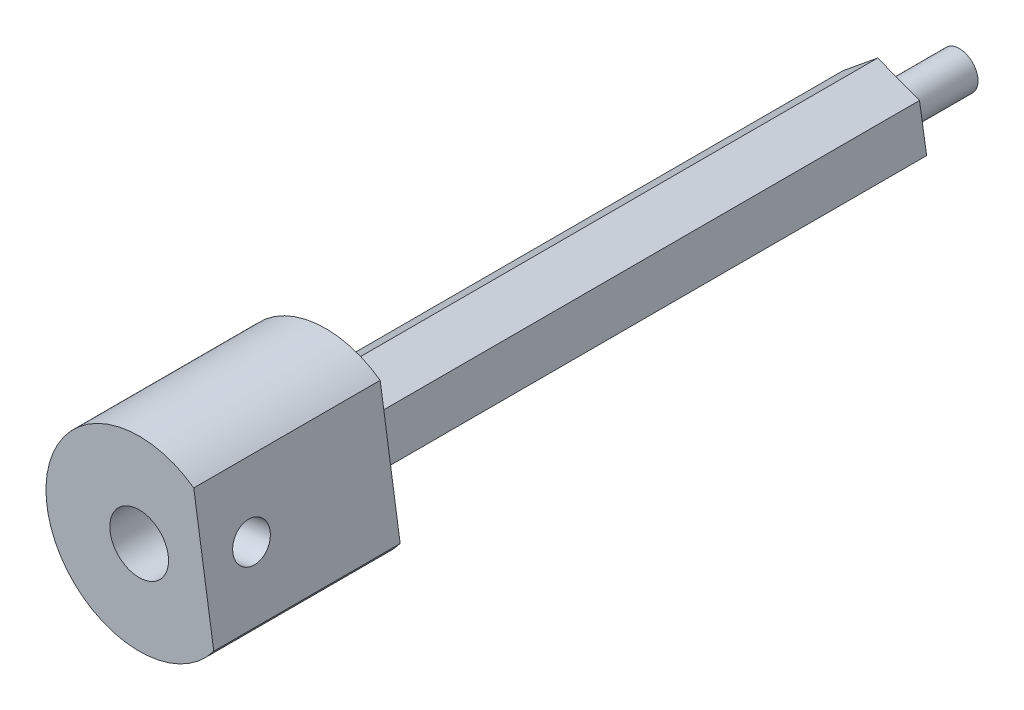
ISO-10303-21;
HEADER;
FILE_DESCRIPTION(('STEP AP214'),'2;1');
FILE_NAME('part.step','',(''),(''),'','','');
FILE_SCHEMA(('AUTOMOTIVE_DESIGN { 1 0 10303 214 1 1 1 1 }'));
ENDSEC;
DATA;
#1=APPLICATION_CONTEXT('core data for automotive mechanical design processes');
#2=APPLICATION_PROTOCOL_DEFINITION('international standard','automotive_design',2000,#1);
#3=PRODUCT_CONTEXT('',#1,'mechanical');
#4=PRODUCT('Part','Part','',(#3));
#5=PRODUCT_RELATED_PRODUCT_CATEGORY('part','',(#4));
#6=PRODUCT_DEFINITION_FORMATION('','',#4);
#7=PRODUCT_DEFINITION_CONTEXT('part definition',#1,'design');
#8=PRODUCT_DEFINITION('design','',#6,#7);
#9=PRODUCT_DEFINITION_SHAPE('','',#8);
#10=(LENGTH_UNIT() NAMED_UNIT(*) SI_UNIT(.MILLI.,.METRE.));
#11=(NAMED_UNIT(*) PLANE_ANGLE_UNIT() SI_UNIT($,.RADIAN.));
#12=(NAMED_UNIT(*) SI_UNIT($,.STERADIAN.) SOLID_ANGLE_UNIT());
#13=UNCERTAINTY_MEASURE_WITH_UNIT(LENGTH_MEASURE(1.E-05),#10,'distance_accuracy_value','');
#14=(GEOMETRIC_REPRESENTATION_CONTEXT(3) GLOBAL_UNCERTAINTY_ASSIGNED_CONTEXT((#13)) GLOBAL_UNIT_ASSIGNED_CONTEXT((#10,
#11,#12)) REPRESENTATION_CONTEXT('',''));
#15=CARTESIAN_POINT('',(0.,0.,0.));
#16=DIRECTION('',(0.,0.,1.));
#17=DIRECTION('',(1.,0.,0.));
#18=AXIS2_PLACEMENT_3D('',#15,#16,#17);
#19=CARTESIAN_POINT('',(0.,0.,0.));
#20=DIRECTION('',(0.,0.,1.));
#21=DIRECTION('',(1.,0.,0.));
#22=AXIS2_PLACEMENT_3D('',#19,#20,#21);
#23=PLANE('',#22);
#24=CARTESIAN_POINT('',(0.,0.,0.));
#25=DIRECTION('',(0.,0.,1.));
#26=DIRECTION('',(1.,0.,0.));
#27=AXIS2_PLACEMENT_3D('',#24,#25,#26);
#28=CIRCLE('',#27,6.35);
#29=CARTESIAN_POINT('',(3.71849353780113,5.14735911019731,0.));
#30=VERTEX_POINT('',#29);
#31=CARTESIAN_POINT('',(5.08203888635515,-3.80727996837298,0.));
#32=VERTEX_POINT('',#31);
#33=EDGE_CURVE('E120',#30,#32,#28,.T.);
#34=ORIENTED_EDGE('',*,*,#33,.F.);
#35=DIRECTION('',(-0.150537261404653,0.988604335884072,0.));
#36=VECTOR('',#35,1.);
#37=CARTESIAN_POINT('',(5.08203888635515,-3.80727996837298,0.));
#38=LINE('',#37,#36);
#39=EDGE_CURVE('E111',#32,#30,#38,.T.);
#40=ORIENTED_EDGE('',*,*,#39,.F.);
#41=EDGE_LOOP('',(#34,#40));
#42=FACE_BOUND('',#41,.T.);
#43=DIRECTION('',(0.774557855145261,0.632503066421636,0.));
#44=VECTOR('',#43,1.);
#45=CARTESIAN_POINT('',(-2.85,1.08061963813011,0.));
#46=LINE('',#45,#44);
#47=CARTESIAN_POINT('',(-2.85,1.08061963813011,0.));
#48=VERTEX_POINT('',#47);
#49=CARTESIAN_POINT('',(-0.489155941550974,3.00848221985071,0.));
#50=VERTEX_POINT('',#49);
#51=EDGE_CURVE('E68',#48,#50,#46,.T.);
#52=ORIENTED_EDGE('',*,*,#51,.F.);
#53=DIRECTION('',(-0.160484795920062,0.987038312467402,0.));
#54=VECTOR('',#53,1.);
#55=CARTESIAN_POINT('',(-2.36084405844903,-1.92786258172059,0.));
#56=LINE('',#55,#54);
#57=CARTESIAN_POINT('',(-2.36084405844903,-1.92786258172059,0.));
#58=VERTEX_POINT('',#57);
#59=EDGE_CURVE('E155',#58,#48,#56,.T.);
#60=ORIENTED_EDGE('',*,*,#59,.F.);
#61=DIRECTION('',(-0.935042651065324,0.354535246045766,0.));
#62=VECTOR('',#61,1.);
#63=CARTESIAN_POINT('',(0.489155941550972,-3.00848221985071,0.));
#64=LINE('',#63,#62);
#65=CARTESIAN_POINT('',(0.489155941550972,-3.00848221985071,0.));
#66=VERTEX_POINT('',#65);
#67=EDGE_CURVE('E159',#66,#58,#64,.T.);
#68=ORIENTED_EDGE('',*,*,#67,.F.);
#69=DIRECTION('',(-0.774557855145261,-0.632503066421636,0.));
#70=VECTOR('',#69,1.);
#71=CARTESIAN_POINT('',(2.85,-1.08061963813011,0.));
#72=LINE('',#71,#70);
#73=CARTESIAN_POINT('',(2.85,-1.08061963813011,0.));
#74=VERTEX_POINT('',#73);
#75=EDGE_CURVE('E163',#74,#66,#72,.T.);
#76=ORIENTED_EDGE('',*,*,#75,.F.);
#77=DIRECTION('',(0.160484795920062,-0.987038312467402,0.));
#78=VECTOR('',#77,1.);
#79=CARTESIAN_POINT('',(2.36084405844903,1.92786258172059,0.));
#80=LINE('',#79,#78);
#81=CARTESIAN_POINT('',(2.36084405844903,1.92786258172059,0.));
#82=VERTEX_POINT('',#81);
#83=EDGE_CURVE('E167',#82,#74,#80,.T.);
#84=ORIENTED_EDGE('',*,*,#83,.F.);
#85=DIRECTION('',(0.935042651065323,-0.354535246045766,0.));
#86=VECTOR('',#85,1.);
#87=CARTESIAN_POINT('',(-0.489155941550974,3.00848221985071,0.));
#88=LINE('',#87,#86);
#89=EDGE_CURVE('E171',#50,#82,#88,.T.);
#90=ORIENTED_EDGE('',*,*,#89,.F.);
#91=EDGE_LOOP('',(#52,#60,#68,#76,#84,#90));
#92=FACE_BOUND('',#91,.T.);
#93=ADVANCED_FACE('F39',(#42,#92),#23,.F.);
#94=CARTESIAN_POINT('',(0.,0.,12.7));
#95=DIRECTION('',(0.,0.,-1.));
#96=DIRECTION('',(-1.,0.,0.));
#97=AXIS2_PLACEMENT_3D('',#94,#95,#96);
#98=CYLINDRICAL_SURFACE('',#97,6.35);
#99=CARTESIAN_POINT('',(0.,0.,12.7));
#100=DIRECTION('',(0.,0.,1.));
#101=DIRECTION('',(1.,0.,0.));
#102=AXIS2_PLACEMENT_3D('',#99,#100,#101);
#103=CIRCLE('',#102,6.35);
#104=CARTESIAN_POINT('',(3.71849353780113,5.14735911019731,12.7));
#105=VERTEX_POINT('',#104);
#106=CARTESIAN_POINT('',(5.08203888635515,-3.80727996837298,12.7));
#107=VERTEX_POINT('',#106);
#108=EDGE_CURVE('E125',#105,#107,#103,.T.);
#109=ORIENTED_EDGE('',*,*,#108,.F.);
#110=DIRECTION('',(0.,0.,-1.));
#111=VECTOR('',#110,1.);
#112=CARTESIAN_POINT('',(3.71849353780113,5.14735911019731,13.97));
#113=LINE('',#112,#111);
#114=EDGE_CURVE('E60',#105,#30,#113,.T.);
#115=ORIENTED_EDGE('',*,*,#114,.T.);
#116=ORIENTED_EDGE('',*,*,#33,.T.);
#117=DIRECTION('',(0.,0.,-1.));
#118=VECTOR('',#117,1.);
#119=CARTESIAN_POINT('',(5.08203888635515,-3.80727996837298,13.97));
#120=LINE('',#119,#118);
#121=EDGE_CURVE('E108',#107,#32,#120,.T.);
#122=ORIENTED_EDGE('',*,*,#121,.F.);
#123=EDGE_LOOP('',(#109,#115,#116,#122));
#124=FACE_BOUND('',#123,.T.);
#125=ADVANCED_FACE('F41',(#124),#98,.T.);
#126=CARTESIAN_POINT('',(0.,0.,12.7));
#127=DIRECTION('',(0.,0.,1.));
#128=DIRECTION('',(1.,0.,0.));
#129=AXIS2_PLACEMENT_3D('',#126,#127,#128);
#130=PLANE('',#129);
#131=CARTESIAN_POINT('',(0.,0.,12.7));
#132=DIRECTION('',(0.,0.,1.));
#133=DIRECTION('',(1.,0.,0.));
#134=AXIS2_PLACEMENT_3D('',#131,#132,#133);
#135=CIRCLE('',#134,2.);
#136=CARTESIAN_POINT('',(2.,0.,12.7));
#137=VERTEX_POINT('',#136);
#138=EDGE_CURVE('E206',#137,#137,#135,.T.);
#139=ORIENTED_EDGE('',*,*,#138,.F.);
#140=EDGE_LOOP('',(#139));
#141=FACE_BOUND('',#140,.T.);
#142=DIRECTION('',(0.150537261404653,-0.988604335884072,0.));
#143=VECTOR('',#142,1.);
#144=CARTESIAN_POINT('',(4.40026621207814,0.670039570912164,12.7));
#145=LINE('',#144,#143);
#146=EDGE_CURVE('E11',#105,#107,#145,.T.);
#147=ORIENTED_EDGE('',*,*,#146,.F.);
#148=ORIENTED_EDGE('',*,*,#108,.T.);
#149=EDGE_LOOP('',(#147,#148));
#150=FACE_BOUND('',#149,.T.);
#151=ADVANCED_FACE('F237',(#141,#150),#130,.T.);
#152=CARTESIAN_POINT('',(-2.85,1.08061963813011,-38.1));
#153=DIRECTION('',(0.632503066421636,-0.774557855145261,0.));
#154=DIRECTION('',(0.774557855145261,0.632503066421636,0.));
#155=AXIS2_PLACEMENT_3D('',#152,#153,#154);
#156=PLANE('',#155);
#157=ORIENTED_EDGE('',*,*,#51,.T.);
#158=DIRECTION('',(0.,0.,1.));
#159=VECTOR('',#158,1.);
#160=CARTESIAN_POINT('',(-0.489155941550974,3.00848221985071,-38.1));
#161=LINE('',#160,#159);
#162=CARTESIAN_POINT('',(-0.489155941550974,3.00848221985071,-38.1));
#163=VERTEX_POINT('',#162);
#164=EDGE_CURVE('E126',#163,#50,#161,.T.);
#165=ORIENTED_EDGE('',*,*,#164,.F.);
#166=DIRECTION('',(0.774557855145261,0.632503066421636,0.));
#167=VECTOR('',#166,1.);
#168=CARTESIAN_POINT('',(-2.85,1.08061963813011,-38.1));
#169=LINE('',#168,#167);
#170=CARTESIAN_POINT('',(-2.85,1.08061963813011,-38.1));
#171=VERTEX_POINT('',#170);
#172=EDGE_CURVE('E158',#171,#163,#169,.T.);
#173=ORIENTED_EDGE('',*,*,#172,.F.);
#174=DIRECTION('',(0.,0.,1.));
#175=VECTOR('',#174,1.);
#176=CARTESIAN_POINT('',(-2.85,1.08061963813011,-38.1));
#177=LINE('',#176,#175);
#178=EDGE_CURVE('E150',#171,#48,#177,.T.);
#179=ORIENTED_EDGE('',*,*,#178,.T.);
#180=EDGE_LOOP('',(#157,#165,#173,#179));
#181=FACE_BOUND('',#180,.T.);
#182=ADVANCED_FACE('F241',(#181),#156,.F.);
#183=CARTESIAN_POINT('',(-0.489155941550974,3.00848221985071,-38.1));
#184=DIRECTION('',(-0.354535246045766,-0.935042651065323,0.));
#185=DIRECTION('',(0.935042651065324,-0.354535246045766,0.));
#186=AXIS2_PLACEMENT_3D('',#183,#184,#185);
#187=PLANE('',#186);
#188=ORIENTED_EDGE('',*,*,#89,.T.);
#189=DIRECTION('',(0.,0.,1.));
#190=VECTOR('',#189,1.);
#191=CARTESIAN_POINT('',(2.36084405844903,1.92786258172059,-38.1));
#192=LINE('',#191,#190);
#193=CARTESIAN_POINT('',(2.36084405844903,1.92786258172059,-38.1));
#194=VERTEX_POINT('',#193);
#195=EDGE_CURVE('E132',#194,#82,#192,.T.);
#196=ORIENTED_EDGE('',*,*,#195,.F.);
#197=DIRECTION('',(0.935042651065323,-0.354535246045766,0.));
#198=VECTOR('',#197,1.);
#199=CARTESIAN_POINT('',(-0.489155941550974,3.00848221985071,-38.1));
#200=LINE('',#199,#198);
#201=EDGE_CURVE('E189',#163,#194,#200,.T.);
#202=ORIENTED_EDGE('',*,*,#201,.F.);
#203=ORIENTED_EDGE('',*,*,#164,.T.);
#204=EDGE_LOOP('',(#188,#196,#202,#203));
#205=FACE_BOUND('',#204,.T.);
#206=ADVANCED_FACE('F245',(#205),#187,.F.);
#207=CARTESIAN_POINT('',(2.36084405844903,1.92786258172059,-38.1));
#208=DIRECTION('',(-0.987038312467402,-0.160484795920062,0.));
#209=DIRECTION('',(0.160484795920062,-0.987038312467402,0.));
#210=AXIS2_PLACEMENT_3D('',#207,#208,#209);
#211=PLANE('',#210);
#212=ORIENTED_EDGE('',*,*,#83,.T.);
#213=DIRECTION('',(0.,0.,1.));
#214=VECTOR('',#213,1.);
#215=CARTESIAN_POINT('',(2.85,-1.08061963813011,-38.1));
#216=LINE('',#215,#214);
#217=CARTESIAN_POINT('',(2.85,-1.08061963813011,-38.1));
#218=VERTEX_POINT('',#217);
#219=EDGE_CURVE('E138',#218,#74,#216,.T.);
#220=ORIENTED_EDGE('',*,*,#219,.F.);
#221=DIRECTION('',(0.160484795920062,-0.987038312467402,0.));
#222=VECTOR('',#221,1.);
#223=CARTESIAN_POINT('',(2.36084405844903,1.92786258172059,-38.1));
#224=LINE('',#223,#222);
#225=EDGE_CURVE('E186',#194,#218,#224,.T.);
#226=ORIENTED_EDGE('',*,*,#225,.F.);
#227=ORIENTED_EDGE('',*,*,#195,.T.);
#228=EDGE_LOOP('',(#212,#220,#226,#227));
#229=FACE_BOUND('',#228,.T.);
#230=ADVANCED_FACE('F249',(#229),#211,.F.);
#231=CARTESIAN_POINT('',(2.85,-1.08061963813011,-38.1));
#232=DIRECTION('',(-0.632503066421636,0.774557855145261,0.));
#233=DIRECTION('',(-0.774557855145261,-0.632503066421636,0.));
#234=AXIS2_PLACEMENT_3D('',#231,#232,#233);
#235=PLANE('',#234);
#236=ORIENTED_EDGE('',*,*,#75,.T.);
#237=DIRECTION('',(0.,0.,1.));
#238=VECTOR('',#237,1.);
#239=CARTESIAN_POINT('',(0.489155941550972,-3.00848221985071,-38.1));
#240=LINE('',#239,#238);
#241=CARTESIAN_POINT('',(0.489155941550972,-3.00848221985071,-38.1));
#242=VERTEX_POINT('',#241);
#243=EDGE_CURVE('E142',#242,#66,#240,.T.);
#244=ORIENTED_EDGE('',*,*,#243,.F.);
#245=DIRECTION('',(-0.774557855145261,-0.632503066421636,0.));
#246=VECTOR('',#245,1.);
#247=CARTESIAN_POINT('',(2.85,-1.08061963813011,-38.1));
#248=LINE('',#247,#246);
#249=EDGE_CURVE('E183',#218,#242,#248,.T.);
#250=ORIENTED_EDGE('',*,*,#249,.F.);
#251=ORIENTED_EDGE('',*,*,#219,.T.);
#252=EDGE_LOOP('',(#236,#244,#250,#251));
#253=FACE_BOUND('',#252,.T.);
#254=ADVANCED_FACE('F253',(#253),#235,.F.);
#255=CARTESIAN_POINT('',(0.489155941550972,-3.00848221985071,-38.1));
#256=DIRECTION('',(0.354535246045766,0.935042651065323,0.));
#257=DIRECTION('',(-0.935042651065324,0.354535246045766,0.));
#258=AXIS2_PLACEMENT_3D('',#255,#256,#257);
#259=PLANE('',#258);
#260=ORIENTED_EDGE('',*,*,#67,.T.);
#261=DIRECTION('',(0.,0.,1.));
#262=VECTOR('',#261,1.);
#263=CARTESIAN_POINT('',(-2.36084405844903,-1.92786258172059,-38.1));
#264=LINE('',#263,#262);
#265=CARTESIAN_POINT('',(-2.36084405844903,-1.92786258172059,-38.1));
#266=VERTEX_POINT('',#265);
#267=EDGE_CURVE('E146',#266,#58,#264,.T.);
#268=ORIENTED_EDGE('',*,*,#267,.F.);
#269=DIRECTION('',(-0.935042651065324,0.354535246045766,0.));
#270=VECTOR('',#269,1.);
#271=CARTESIAN_POINT('',(0.489155941550972,-3.00848221985071,-38.1));
#272=LINE('',#271,#270);
#273=EDGE_CURVE('E180',#242,#266,#272,.T.);
#274=ORIENTED_EDGE('',*,*,#273,.F.);
#275=ORIENTED_EDGE('',*,*,#243,.T.);
#276=EDGE_LOOP('',(#260,#268,#274,#275));
#277=FACE_BOUND('',#276,.T.);
#278=ADVANCED_FACE('F257',(#277),#259,.F.);
#279=CARTESIAN_POINT('',(-2.36084405844903,-1.92786258172059,-38.1));
#280=DIRECTION('',(0.987038312467402,0.160484795920062,0.));
#281=DIRECTION('',(-0.160484795920062,0.987038312467402,0.));
#282=AXIS2_PLACEMENT_3D('',#279,#280,#281);
#283=PLANE('',#282);
#284=ORIENTED_EDGE('',*,*,#59,.T.);
#285=ORIENTED_EDGE('',*,*,#178,.F.);
#286=DIRECTION('',(-0.160484795920062,0.987038312467402,0.));
#287=VECTOR('',#286,1.);
#288=CARTESIAN_POINT('',(-2.36084405844903,-1.92786258172059,-38.1));
#289=LINE('',#288,#287);
#290=EDGE_CURVE('E154',#266,#171,#289,.T.);
#291=ORIENTED_EDGE('',*,*,#290,.F.);
#292=ORIENTED_EDGE('',*,*,#267,.T.);
#293=EDGE_LOOP('',(#284,#285,#291,#292));
#294=FACE_BOUND('',#293,.T.);
#295=ADVANCED_FACE('F261',(#294),#283,.F.);
#296=CARTESIAN_POINT('',(0.,0.,-38.1));
#297=DIRECTION('',(0.,0.,-1.));
#298=DIRECTION('',(-1.,0.,0.));
#299=AXIS2_PLACEMENT_3D('',#296,#297,#298);
#300=PLANE('',#299);
#301=CARTESIAN_POINT('',(0.,0.,-38.1));
#302=DIRECTION('',(0.,0.,-1.));
#303=DIRECTION('',(-1.,0.,0.));
#304=AXIS2_PLACEMENT_3D('',#301,#302,#303);
#305=CIRCLE('',#304,1.27);
#306=CARTESIAN_POINT('',(-1.27,0.,-38.1));
#307=VERTEX_POINT('',#306);
#308=EDGE_CURVE('E54',#307,#307,#305,.T.);
#309=ORIENTED_EDGE('',*,*,#308,.F.);
#310=EDGE_LOOP('',(#309));
#311=FACE_BOUND('',#310,.T.);
#312=ORIENTED_EDGE('',*,*,#172,.T.);
#313=ORIENTED_EDGE('',*,*,#201,.T.);
#314=ORIENTED_EDGE('',*,*,#225,.T.);
#315=ORIENTED_EDGE('',*,*,#249,.T.);
#316=ORIENTED_EDGE('',*,*,#273,.T.);
#317=ORIENTED_EDGE('',*,*,#290,.T.);
#318=EDGE_LOOP('',(#312,#313,#314,#315,#316,#317));
#319=FACE_BOUND('',#318,.T.);
#320=ADVANCED_FACE('F265',(#311,#319),#300,.T.);
#321=CARTESIAN_POINT('',(0.,0.,-43.18));
#322=DIRECTION('',(0.,0.,1.));
#323=DIRECTION('',(1.,0.,0.));
#324=AXIS2_PLACEMENT_3D('',#321,#322,#323);
#325=CYLINDRICAL_SURFACE('',#324,1.27);
#326=CARTESIAN_POINT('',(0.,0.,-43.18));
#327=DIRECTION('',(0.,0.,-1.));
#328=DIRECTION('',(-1.,0.,0.));
#329=AXIS2_PLACEMENT_3D('',#326,#327,#328);
#330=CIRCLE('',#329,1.27);
#331=CARTESIAN_POINT('',(-1.27,0.,-43.18));
#332=VERTEX_POINT('',#331);
#333=EDGE_CURVE('E177',#332,#332,#330,.T.);
#334=ORIENTED_EDGE('',*,*,#333,.F.);
#335=EDGE_LOOP('',(#334));
#336=FACE_BOUND('',#335,.T.);
#337=ORIENTED_EDGE('',*,*,#308,.T.);
#338=EDGE_LOOP('',(#337));
#339=FACE_BOUND('',#338,.T.);
#340=ADVANCED_FACE('F269',(#336,#339),#325,.T.);
#341=CARTESIAN_POINT('',(0.,0.,-43.18));
#342=DIRECTION('',(0.,0.,-1.));
#343=DIRECTION('',(-1.,0.,0.));
#344=AXIS2_PLACEMENT_3D('',#341,#342,#343);
#345=PLANE('',#344);
#346=ORIENTED_EDGE('',*,*,#333,.T.);
#347=EDGE_LOOP('',(#346));
#348=FACE_BOUND('',#347,.T.);
#349=ADVANCED_FACE('F273',(#348),#345,.T.);
#350=CARTESIAN_POINT('',(5.08203888635515,-3.80727996837298,13.97));
#351=DIRECTION('',(-0.988604335884072,-0.150537261404653,0.));
#352=DIRECTION('',(0.150537261404653,-0.988604335884072,0.));
#353=AXIS2_PLACEMENT_3D('',#350,#351,#352);
#354=PLANE('',#353);
#355=CARTESIAN_POINT('',(4.40026621207814,0.670039570912164,9.44643499926262));
#356=DIRECTION('',(0.988604335884072,0.150537261404653,0.));
#357=DIRECTION('',(-0.150537261404653,0.988604335884072,0.));
#358=AXIS2_PLACEMENT_3D('',#355,#356,#357);
#359=CIRCLE('',#358,1.27);
#360=CARTESIAN_POINT('',(4.20908389009423,1.92556707748494,9.44643499926262));
#361=VERTEX_POINT('',#360);
#362=EDGE_CURVE('E122',#361,#361,#359,.T.);
#363=ORIENTED_EDGE('',*,*,#362,.F.);
#364=EDGE_LOOP('',(#363));
#365=FACE_BOUND('',#364,.T.);
#366=ORIENTED_EDGE('',*,*,#146,.T.);
#367=ORIENTED_EDGE('',*,*,#121,.T.);
#368=ORIENTED_EDGE('',*,*,#39,.T.);
#369=ORIENTED_EDGE('',*,*,#114,.F.);
#370=EDGE_LOOP('',(#366,#367,#368,#369));
#371=FACE_BOUND('',#370,.T.);
#372=ADVANCED_FACE('F110',(#365,#371),#354,.F.);
#373=CARTESIAN_POINT('',(-0.621843814212944,-0.0946897170234723,9.44643499926262));
#374=DIRECTION('',(0.988604335884072,0.150537261404653,0.));
#375=DIRECTION('',(-0.150537261404653,0.988604335884072,0.));
#376=AXIS2_PLACEMENT_3D('',#373,#374,#375);
#377=CYLINDRICAL_SURFACE('',#376,1.27);
#378=CARTESIAN_POINT('',(1.33623537201937,1.48811122923129,9.44643499926262));
#379=CARTESIAN_POINT('',(1.3362459354056,1.48810672292884,9.38358614524702));
#380=CARTESIAN_POINT('',(1.34080702353934,1.48404484898452,9.32064978703948));
#381=CARTESIAN_POINT('',(1.35830808286538,1.4680353635054,9.19692877528168));
#382=CARTESIAN_POINT('',(1.37126925241339,1.45606779977888,9.13614997696046));
#383=CARTESIAN_POINT('',(1.4035608584849,1.42495944680231,9.01890988421684));
#384=CARTESIAN_POINT('',(1.42283435472909,1.40588258225253,8.9624153581099));
#385=CARTESIAN_POINT('',(1.46574462596472,1.36108533806361,8.85395561193315));
#386=CARTESIAN_POINT('',(1.48938175384916,1.33536442104344,8.80199075868505));
#387=CARTESIAN_POINT('',(1.54265764634789,1.27361325368855,8.69612554820527));
#388=CARTESIAN_POINT('',(1.57267390470029,1.23664673423724,8.64296106320524));
#389=CARTESIAN_POINT('',(1.63368992715561,1.15484463954954,8.54364802757386));
#390=CARTESIAN_POINT('',(1.66469053872199,1.11000212436783,8.49750573204306));
#391=CARTESIAN_POINT('',(1.72944759156105,1.00656998661912,8.40777692647702));
#392=CARTESIAN_POINT('',(1.76305890499338,0.946960053211003,8.36524555213265));
#393=CARTESIAN_POINT('',(1.82604535118572,0.818919521695572,8.29190068659739));
#394=CARTESIAN_POINT('',(1.85542477771122,0.750497999486265,8.26107526556178));
#395=CARTESIAN_POINT('',(1.90461973538264,0.614100283952518,8.21548646085308));
#396=CARTESIAN_POINT('',(1.92511273750597,0.546820199662942,8.19938437216038));
#397=CARTESIAN_POINT('',(1.95906019603692,0.408795133151723,8.17912867387208));
#398=CARTESIAN_POINT('',(1.97252237049458,0.338054043957267,8.17496193967276));
#399=CARTESIAN_POINT('',(1.99035057674387,0.205758231705606,8.1785733577294));
#400=CARTESIAN_POINT('',(1.99571764468204,0.144287114584401,8.18477816567727));
#401=CARTESIAN_POINT('',(2.0007981271807,0.0226310846885079,8.20589818891657));
#402=CARTESIAN_POINT('',(2.00051111539551,-0.0375537307500975,8.22081406098317));
#403=CARTESIAN_POINT('',(1.99484530771721,-0.155130125428374,8.25866951087919));
#404=CARTESIAN_POINT('',(1.98946072981144,-0.21251845496754,8.28161818143326));
#405=CARTESIAN_POINT('',(1.9744932313618,-0.32326974556096,8.3346730077477));
#406=CARTESIAN_POINT('',(1.9649094043617,-0.376631834587996,8.36478070822498));
#407=CARTESIAN_POINT('',(1.94120500327377,-0.484944194386063,8.43555305402291));
#408=CARTESIAN_POINT('',(1.92666436189509,-0.539244093392051,8.4770707091103));
#409=CARTESIAN_POINT('',(1.89529162614461,-0.64086287202453,8.56728195577973));
#410=CARTESIAN_POINT('',(1.87845613327735,-0.688171176912347,8.61598619913161));
#411=CARTESIAN_POINT('',(1.84203813323692,-0.780828940117353,8.72698122734617));
#412=CARTESIAN_POINT('',(1.82239439500806,-0.825029127160113,8.79021911380939));
#413=CARTESIAN_POINT('',(1.78577614151715,-0.901558650757577,8.92419560895547));
#414=CARTESIAN_POINT('',(1.76879679560445,-0.933909615951995,8.99492024453496));
#415=CARTESIAN_POINT('',(1.74481499548476,-0.977788517808205,9.12255848861522));
#416=CARTESIAN_POINT('',(1.73635758892634,-0.992576135238374,9.17807497279749));
#417=CARTESIAN_POINT('',(1.72406241054716,-1.01378709502559,9.2911527427029));
#418=CARTESIAN_POINT('',(1.72021792897395,-1.02022258712284,9.34871093278645));
#419=CARTESIAN_POINT('',(1.7178107537673,-1.02427216362146,9.46441171267637));
#420=CARTESIAN_POINT('',(1.71926241823497,-1.02186226765232,9.52255546432576));
#421=CARTESIAN_POINT('',(1.72721388597402,-1.00835966040848,9.6374889910962));
#422=CARTESIAN_POINT('',(1.73371790684357,-0.997259694790322,9.69427759412561));
#423=CARTESIAN_POINT('',(1.75049939755244,-0.967487161093415,9.80373242393317));
#424=CARTESIAN_POINT('',(1.76068479080894,-0.948998299497961,9.85646409675614));
#425=CARTESIAN_POINT('',(1.78353587002851,-0.905320959339432,9.95847488409517));
#426=CARTESIAN_POINT('',(1.79620242273876,-0.880130138466077,10.0077527839079));
#427=CARTESIAN_POINT('',(1.82529284178401,-0.818341893780906,10.1115990301053));
#428=CARTESIAN_POINT('',(1.84196931911621,-0.780480255313232,10.1653440187247));
#429=CARTESIAN_POINT('',(1.87505986620882,-0.697252484401839,10.2668129854636));
#430=CARTESIAN_POINT('',(1.89147363824119,-0.651878418837449,10.3145305036543));
#431=CARTESIAN_POINT('',(1.92498077759453,-0.545933276514468,10.4110327785771));
#432=CARTESIAN_POINT('',(1.94169869954806,-0.484091300306313,10.458568570555));
#433=CARTESIAN_POINT('',(1.96984745193153,-0.352453208470119,10.5430885240311));
#434=CARTESIAN_POINT('',(1.98128022025913,-0.282660020017343,10.58007655115));
#435=CARTESIAN_POINT('',(1.99623837854659,-0.140850657439911,10.6401125731009));
#436=CARTESIAN_POINT('',(2.00015033120177,-0.0691477564705878,10.6637948711123));
#437=CARTESIAN_POINT('',(1.99984156418836,0.0772048188617112,10.6985987909286));
#438=CARTESIAN_POINT('',(1.99563300479896,0.151849923384288,10.7097391544355));
#439=CARTESIAN_POINT('',(1.97995832294292,0.289511522591966,10.7179756079418));
#440=CARTESIAN_POINT('',(1.96970080107922,0.352560253303728,10.7169592828651));
#441=CARTESIAN_POINT('',(1.94342865111987,0.476546429308179,10.7054224843906));
#442=CARTESIAN_POINT('',(1.927414459866,0.537484034417911,10.6949027320638));
#443=CARTESIAN_POINT('',(1.89132625153213,0.652988880525089,10.6655875626778));
#444=CARTESIAN_POINT('',(1.87145657148928,0.70771740555411,10.6471677107219));
#445=CARTESIAN_POINT('',(1.82834215180786,0.81264091016118,10.6029340566263));
#446=CARTESIAN_POINT('',(1.80509689394717,0.862835191714864,10.5771191185923));
#447=CARTESIAN_POINT('',(1.75395578244499,0.962862804413057,10.5159695528552));
#448=CARTESIAN_POINT('',(1.72582733913923,1.01214872425019,10.4799372165511));
#449=CARTESIAN_POINT('',(1.66853446439431,1.10405257972496,10.4008205968326));
#450=CARTESIAN_POINT('',(1.63936892900531,1.14666313208549,10.3577286113399));
#451=CARTESIAN_POINT('',(1.57740478227919,1.23081848100795,10.2582769689387));
#452=CARTESIAN_POINT('',(1.54471754627936,1.27124437314604,10.2008967235566));
#453=CARTESIAN_POINT('',(1.48320877945354,1.34250048146992,10.078553292945));
#454=CARTESIAN_POINT('',(1.45438565925257,1.37333464982414,10.0135932461048));
#455=CARTESIAN_POINT('',(1.40956273253574,1.41912982778761,9.89181457449122));
#456=CARTESIAN_POINT('',(1.39213781960206,1.43608113243139,9.8362704588767));
#457=CARTESIAN_POINT('',(1.36371801619104,1.4631012629049,9.72203212192455));
#458=CARTESIAN_POINT('',(1.35270358698977,1.47319101828313,9.66334807436282));
#459=CARTESIAN_POINT('',(1.3425188836082,1.48244982910725,9.57783951201199));
#460=CARTESIAN_POINT('',(1.34017138118243,1.48456925781337,9.55166666302412));
#461=CARTESIAN_POINT('',(1.33702719848105,1.48740109479728,9.49914603853475));
#462=CARTESIAN_POINT('',(1.3362309409942,1.48811311949064,9.47279821730768));
#463=CARTESIAN_POINT('',(1.33623537201937,1.48811122923129,9.44643499926262));
#464=B_SPLINE_CURVE_WITH_KNOTS('',3,(#378,#379,#380,#381,#382,#383,#384,#385,#386,#387,#388,
#389,#390,#391,#392,#393,#394,#395,#396,#397,#398,#399,#400,#401,#402,#403,#404,#405,#406,#407,
#408,#409,#410,#411,#412,#413,#414,#415,#416,#417,#418,#419,#420,#421,#422,#423,#424,#425,#426,
#427,#428,#429,#430,#431,#432,#433,#434,#435,#436,#437,#438,#439,#440,#441,#442,#443,#444,#445,
#446,#447,#448,#449,#450,#451,#452,#453,#454,#455,#456,#457,#458,#459,#460,#461,#462,#463),
.UNSPECIFIED.,.T.,.F.,(4,2,2,2,2,2,2,2,2,2,2,2,2,2,2,2,2,2,2,2,2,2,2,2,2,2,2,2,2,2,2,2,2,2,2,2,
2,2,2,2,2,2,4),(0.,0.188425592749621,0.377328555681357,0.564572407693617,0.751831409017281,
0.965132794159912,1.17862308179422,1.41902144774929,1.65917415568659,1.87430962741166,
2.08920843638889,2.27436556916243,2.45953666375585,2.64491804419953,2.83033946107646,
3.03917560466276,3.24832444804995,3.48602813405595,3.72329574624744,3.89679140896612,
4.07003440561151,4.24374742075338,4.41760560381366,4.58738627421345,4.75722636046488,
4.95995494038561,5.16289898326821,5.40102401218327,5.63906165883767,5.86449801689623,
6.08959705119754,6.28026448691327,6.47091745698609,6.65336693964107,6.83584446179597,
7.03673349569698,7.23784317723807,7.46912371987314,7.70030883918978,7.88153151899998,
8.06219891182995,8.14121628993606,8.22025520106234),.UNSPECIFIED.);
#465=CARTESIAN_POINT('',(1.33623537201937,1.48811122923129,9.44643499926262));
#466=VERTEX_POINT('',#465);
#467=EDGE_CURVE('E43',#466,#466,#464,.T.);
#468=ORIENTED_EDGE('',*,*,#467,.T.);
#469=EDGE_LOOP('',(#468));
#470=FACE_BOUND('',#469,.T.);
#471=ORIENTED_EDGE('',*,*,#362,.T.);
#472=EDGE_LOOP('',(#471));
#473=FACE_BOUND('',#472,.T.);
#474=ADVANCED_FACE('F219',(#470,#473),#377,.F.);
#475=CARTESIAN_POINT('',(0.,0.,6.35));
#476=DIRECTION('',(0.,0.,1.));
#477=DIRECTION('',(1.,0.,0.));
#478=AXIS2_PLACEMENT_3D('',#475,#476,#477);
#479=CYLINDRICAL_SURFACE('',#478,2.);
#480=ORIENTED_EDGE('',*,*,#138,.T.);
#481=EDGE_LOOP('',(#480));
#482=FACE_BOUND('',#481,.T.);
#483=CARTESIAN_POINT('',(0.,0.,6.35));
#484=DIRECTION('',(0.,0.,1.));
#485=DIRECTION('',(1.,0.,0.));
#486=AXIS2_PLACEMENT_3D('',#483,#484,#485);
#487=CIRCLE('',#486,2.);
#488=CARTESIAN_POINT('',(2.,0.,6.35));
#489=VERTEX_POINT('',#488);
#490=EDGE_CURVE('E210',#489,#489,#487,.T.);
#491=ORIENTED_EDGE('',*,*,#490,.F.);
#492=EDGE_LOOP('',(#491));
#493=FACE_BOUND('',#492,.T.);
#494=ORIENTED_EDGE('',*,*,#467,.F.);
#495=EDGE_LOOP('',(#494));
#496=FACE_BOUND('',#495,.T.);
#497=ADVANCED_FACE('F222',(#482,#493,#496),#479,.F.);
#498=CARTESIAN_POINT('',(0.,0.,6.35));
#499=DIRECTION('',(0.,0.,1.));
#500=DIRECTION('',(1.,0.,0.));
#501=AXIS2_PLACEMENT_3D('',#498,#499,#500);
#502=PLANE('',#501);
#503=ORIENTED_EDGE('',*,*,#490,.T.);
#504=EDGE_LOOP('',(#503));
#505=FACE_BOUND('',#504,.T.);
#506=ADVANCED_FACE('F224',(#505),#502,.T.);
#507=CLOSED_SHELL('',(#93,#125,#151,#182,#206,#230,#254,#278,#295,#320,#340,#349,#372,#474,#497,#506));
#508=MANIFOLD_SOLID_BREP('B2',#507);
#509=ADVANCED_BREP_SHAPE_REPRESENTATION('',(#18,#508),#14);
#510=SHAPE_DEFINITION_REPRESENTATION(#9,#509);
ENDSEC;
END-ISO-10303-21;
